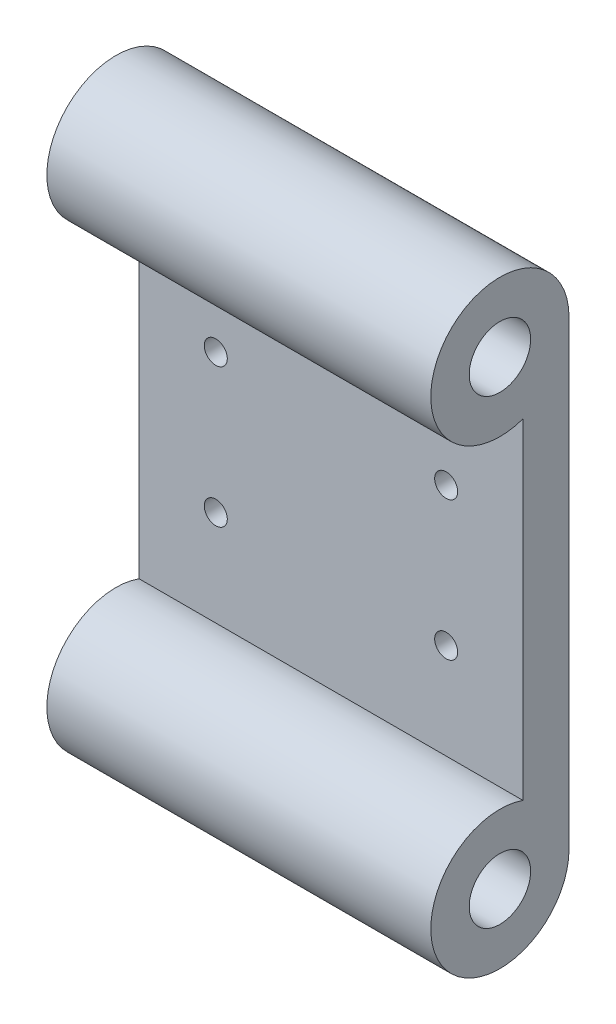
ISO-10303-21;
HEADER;
FILE_DESCRIPTION(('STEP AP214'),'2;1');
FILE_NAME('part.step','',(''),(''),'','','');
FILE_SCHEMA(('AUTOMOTIVE_DESIGN { 1 0 10303 214 1 1 1 1 }'));
ENDSEC;
DATA;
#1=APPLICATION_CONTEXT('core data for automotive mechanical design processes');
#2=APPLICATION_PROTOCOL_DEFINITION('international standard','automotive_design',2000,#1);
#3=PRODUCT_CONTEXT('',#1,'mechanical');
#4=PRODUCT('Part','Part','',(#3));
#5=PRODUCT_RELATED_PRODUCT_CATEGORY('part','',(#4));
#6=PRODUCT_DEFINITION_FORMATION('','',#4);
#7=PRODUCT_DEFINITION_CONTEXT('part definition',#1,'design');
#8=PRODUCT_DEFINITION('design','',#6,#7);
#9=PRODUCT_DEFINITION_SHAPE('','',#8);
#10=(LENGTH_UNIT() NAMED_UNIT(*) SI_UNIT(.MILLI.,.METRE.));
#11=(NAMED_UNIT(*) PLANE_ANGLE_UNIT() SI_UNIT($,.RADIAN.));
#12=(NAMED_UNIT(*) SI_UNIT($,.STERADIAN.) SOLID_ANGLE_UNIT());
#13=UNCERTAINTY_MEASURE_WITH_UNIT(LENGTH_MEASURE(1.E-05),#10,'distance_accuracy_value','');
#14=(GEOMETRIC_REPRESENTATION_CONTEXT(3) GLOBAL_UNCERTAINTY_ASSIGNED_CONTEXT((#13)) GLOBAL_UNIT_ASSIGNED_CONTEXT((#10,
#11,#12)) REPRESENTATION_CONTEXT('',''));
#15=CARTESIAN_POINT('',(0.,0.,0.));
#16=DIRECTION('',(0.,0.,1.));
#17=DIRECTION('',(1.,0.,0.));
#18=AXIS2_PLACEMENT_3D('',#15,#16,#17);
#19=CARTESIAN_POINT('',(50.,30.,0.));
#20=DIRECTION('',(1.,0.,0.));
#21=DIRECTION('',(0.,0.,-1.));
#22=AXIS2_PLACEMENT_3D('',#19,#20,#21);
#23=PLANE('',#22);
#24=CARTESIAN_POINT('',(50.,30.,0.));
#25=DIRECTION('',(1.,0.,0.));
#26=DIRECTION('',(0.,0.,-1.));
#27=AXIS2_PLACEMENT_3D('',#24,#25,#26);
#28=CIRCLE('',#27,4.);
#29=CARTESIAN_POINT('',(50.,30.,-3.99999999999999));
#30=VERTEX_POINT('',#29);
#31=EDGE_CURVE('E103',#30,#30,#28,.T.);
#32=ORIENTED_EDGE('',*,*,#31,.F.);
#33=EDGE_LOOP('',(#32));
#34=FACE_BOUND('',#33,.T.);
#35=CARTESIAN_POINT('',(50.,30.,0.));
#36=DIRECTION('',(1.,0.,0.));
#37=DIRECTION('',(0.,0.,-1.));
#38=AXIS2_PLACEMENT_3D('',#35,#36,#37);
#39=CIRCLE('',#38,9.);
#40=CARTESIAN_POINT('',(50.,30.,-8.99999999999999));
#41=VERTEX_POINT('',#40);
#42=CARTESIAN_POINT('',(50.,21.5147186257614,-2.99999999999999));
#43=VERTEX_POINT('',#42);
#44=EDGE_CURVE('E87',#41,#43,#39,.T.);
#45=ORIENTED_EDGE('',*,*,#44,.T.);
#46=DIRECTION('',(0.,-1.,0.));
#47=VECTOR('',#46,1.);
#48=CARTESIAN_POINT('',(50.,-21.5147186257614,-3.));
#49=LINE('',#48,#47);
#50=CARTESIAN_POINT('',(50.,-21.5147186257614,-3.00000000000001));
#51=VERTEX_POINT('',#50);
#52=EDGE_CURVE('E82',#43,#51,#49,.T.);
#53=ORIENTED_EDGE('',*,*,#52,.T.);
#54=CARTESIAN_POINT('',(50.,-30.,0.));
#55=DIRECTION('',(1.,0.,0.));
#56=DIRECTION('',(0.,0.,-1.));
#57=AXIS2_PLACEMENT_3D('',#54,#55,#56);
#58=CIRCLE('',#57,9.);
#59=CARTESIAN_POINT('',(50.,-30.,-9.00000000000001));
#60=VERTEX_POINT('',#59);
#61=EDGE_CURVE('E85',#51,#60,#58,.T.);
#62=ORIENTED_EDGE('',*,*,#61,.T.);
#63=DIRECTION('',(0.,1.,0.));
#64=VECTOR('',#63,1.);
#65=CARTESIAN_POINT('',(50.,30.,-8.99999999999999));
#66=LINE('',#65,#64);
#67=EDGE_CURVE('E52',#60,#41,#66,.T.);
#68=ORIENTED_EDGE('',*,*,#67,.T.);
#69=EDGE_LOOP('',(#45,#53,#62,#68));
#70=FACE_BOUND('',#69,.T.);
#71=CARTESIAN_POINT('',(50.,-30.,0.));
#72=DIRECTION('',(1.,0.,0.));
#73=DIRECTION('',(0.,0.,-1.));
#74=AXIS2_PLACEMENT_3D('',#71,#72,#73);
#75=CIRCLE('',#74,4.);
#76=CARTESIAN_POINT('',(50.,-30.,-4.00000000000001));
#77=VERTEX_POINT('',#76);
#78=EDGE_CURVE('E132',#77,#77,#75,.T.);
#79=ORIENTED_EDGE('',*,*,#78,.F.);
#80=EDGE_LOOP('',(#79));
#81=FACE_BOUND('',#80,.T.);
#82=ADVANCED_FACE('F33',(#34,#70,#81),#23,.T.);
#83=CARTESIAN_POINT('',(0.,30.,0.));
#84=DIRECTION('',(1.,0.,0.));
#85=DIRECTION('',(0.,0.,-1.));
#86=AXIS2_PLACEMENT_3D('',#83,#84,#85);
#87=PLANE('',#86);
#88=CARTESIAN_POINT('',(0.,30.,0.));
#89=DIRECTION('',(1.,0.,0.));
#90=DIRECTION('',(0.,0.,-1.));
#91=AXIS2_PLACEMENT_3D('',#88,#89,#90);
#92=CIRCLE('',#91,9.);
#93=CARTESIAN_POINT('',(0.,30.,-8.99999999999999));
#94=VERTEX_POINT('',#93);
#95=CARTESIAN_POINT('',(0.,21.5147186257614,-2.99999999999999));
#96=VERTEX_POINT('',#95);
#97=EDGE_CURVE('E100',#94,#96,#92,.T.);
#98=ORIENTED_EDGE('',*,*,#97,.F.);
#99=DIRECTION('',(0.,1.,0.));
#100=VECTOR('',#99,1.);
#101=CARTESIAN_POINT('',(0.,30.,-8.99999999999999));
#102=LINE('',#101,#100);
#103=CARTESIAN_POINT('',(0.,-30.,-9.00000000000001));
#104=VERTEX_POINT('',#103);
#105=EDGE_CURVE('E75',#104,#94,#102,.T.);
#106=ORIENTED_EDGE('',*,*,#105,.F.);
#107=CARTESIAN_POINT('',(0.,-30.,0.));
#108=DIRECTION('',(1.,0.,0.));
#109=DIRECTION('',(0.,0.,-1.));
#110=AXIS2_PLACEMENT_3D('',#107,#108,#109);
#111=CIRCLE('',#110,9.);
#112=CARTESIAN_POINT('',(0.,-21.5147186257614,-3.00000000000001));
#113=VERTEX_POINT('',#112);
#114=EDGE_CURVE('E69',#113,#104,#111,.T.);
#115=ORIENTED_EDGE('',*,*,#114,.F.);
#116=DIRECTION('',(0.,-1.,0.));
#117=VECTOR('',#116,1.);
#118=CARTESIAN_POINT('',(0.,-21.5147186257614,-3.));
#119=LINE('',#118,#117);
#120=EDGE_CURVE('E91',#96,#113,#119,.T.);
#121=ORIENTED_EDGE('',*,*,#120,.F.);
#122=EDGE_LOOP('',(#98,#106,#115,#121));
#123=FACE_BOUND('',#122,.T.);
#124=CARTESIAN_POINT('',(0.,30.,0.));
#125=DIRECTION('',(1.,0.,0.));
#126=DIRECTION('',(0.,0.,-1.));
#127=AXIS2_PLACEMENT_3D('',#124,#125,#126);
#128=CIRCLE('',#127,4.);
#129=CARTESIAN_POINT('',(0.,30.,-3.99999999999999));
#130=VERTEX_POINT('',#129);
#131=EDGE_CURVE('E135',#130,#130,#128,.T.);
#132=ORIENTED_EDGE('',*,*,#131,.T.);
#133=EDGE_LOOP('',(#132));
#134=FACE_BOUND('',#133,.T.);
#135=CARTESIAN_POINT('',(0.,-30.,0.));
#136=DIRECTION('',(1.,0.,0.));
#137=DIRECTION('',(0.,0.,-1.));
#138=AXIS2_PLACEMENT_3D('',#135,#136,#137);
#139=CIRCLE('',#138,4.);
#140=CARTESIAN_POINT('',(0.,-30.,-4.00000000000001));
#141=VERTEX_POINT('',#140);
#142=EDGE_CURVE('E112',#141,#141,#139,.T.);
#143=ORIENTED_EDGE('',*,*,#142,.T.);
#144=EDGE_LOOP('',(#143));
#145=FACE_BOUND('',#144,.T.);
#146=ADVANCED_FACE('F143',(#123,#134,#145),#87,.F.);
#147=CARTESIAN_POINT('',(50.,30.,0.));
#148=DIRECTION('',(-1.,0.,0.));
#149=DIRECTION('',(0.,0.,1.));
#150=AXIS2_PLACEMENT_3D('',#147,#148,#149);
#151=CYLINDRICAL_SURFACE('',#150,9.);
#152=ORIENTED_EDGE('',*,*,#97,.T.);
#153=DIRECTION('',(-1.,0.,0.));
#154=VECTOR('',#153,1.);
#155=CARTESIAN_POINT('',(50.,21.5147186257614,-2.99999999999999));
#156=LINE('',#155,#154);
#157=EDGE_CURVE('E11',#43,#96,#156,.T.);
#158=ORIENTED_EDGE('',*,*,#157,.F.);
#159=ORIENTED_EDGE('',*,*,#44,.F.);
#160=DIRECTION('',(-1.,0.,0.));
#161=VECTOR('',#160,1.);
#162=CARTESIAN_POINT('',(50.,30.,-8.99999999999999));
#163=LINE('',#162,#161);
#164=EDGE_CURVE('E96',#41,#94,#163,.T.);
#165=ORIENTED_EDGE('',*,*,#164,.T.);
#166=EDGE_LOOP('',(#152,#158,#159,#165));
#167=FACE_BOUND('',#166,.T.);
#168=ADVANCED_FACE('F35',(#167),#151,.T.);
#169=CARTESIAN_POINT('',(50.,-21.5147186257614,-3.));
#170=DIRECTION('',(0.,0.,-1.));
#171=DIRECTION('',(0.,1.,0.));
#172=AXIS2_PLACEMENT_3D('',#169,#170,#171);
#173=PLANE('',#172);
#174=CARTESIAN_POINT('',(40.,9.04442852285327,-3.));
#175=DIRECTION('',(0.,0.,1.));
#176=DIRECTION('',(1.,0.,0.));
#177=AXIS2_PLACEMENT_3D('',#174,#175,#176);
#178=CIRCLE('',#177,1.5);
#179=CARTESIAN_POINT('',(41.5,9.04442852285327,-3.));
#180=VERTEX_POINT('',#179);
#181=EDGE_CURVE('E117',#180,#180,#178,.T.);
#182=ORIENTED_EDGE('',*,*,#181,.F.);
#183=EDGE_LOOP('',(#182));
#184=FACE_BOUND('',#183,.T.);
#185=CARTESIAN_POINT('',(40.,-9.04442852285327,-3.));
#186=DIRECTION('',(0.,0.,1.));
#187=DIRECTION('',(1.,0.,0.));
#188=AXIS2_PLACEMENT_3D('',#185,#186,#187);
#189=CIRCLE('',#188,1.5);
#190=CARTESIAN_POINT('',(41.5,-9.04442852285327,-3.));
#191=VERTEX_POINT('',#190);
#192=EDGE_CURVE('E183',#191,#191,#189,.T.);
#193=ORIENTED_EDGE('',*,*,#192,.F.);
#194=EDGE_LOOP('',(#193));
#195=FACE_BOUND('',#194,.T.);
#196=CARTESIAN_POINT('',(10.,-9.04442852285327,-3.));
#197=DIRECTION('',(0.,0.,1.));
#198=DIRECTION('',(1.,0.,0.));
#199=AXIS2_PLACEMENT_3D('',#196,#197,#198);
#200=CIRCLE('',#199,1.5);
#201=CARTESIAN_POINT('',(11.5,-9.04442852285327,-3.));
#202=VERTEX_POINT('',#201);
#203=EDGE_CURVE('E130',#202,#202,#200,.T.);
#204=ORIENTED_EDGE('',*,*,#203,.F.);
#205=EDGE_LOOP('',(#204));
#206=FACE_BOUND('',#205,.T.);
#207=CARTESIAN_POINT('',(10.,9.04442852285326,-3.));
#208=DIRECTION('',(0.,0.,1.));
#209=DIRECTION('',(1.,0.,0.));
#210=AXIS2_PLACEMENT_3D('',#207,#208,#209);
#211=CIRCLE('',#210,1.5);
#212=CARTESIAN_POINT('',(11.5,9.04442852285326,-3.));
#213=VERTEX_POINT('',#212);
#214=EDGE_CURVE('E113',#213,#213,#211,.T.);
#215=ORIENTED_EDGE('',*,*,#214,.F.);
#216=EDGE_LOOP('',(#215));
#217=FACE_BOUND('',#216,.T.);
#218=ORIENTED_EDGE('',*,*,#120,.T.);
#219=DIRECTION('',(-1.,0.,0.));
#220=VECTOR('',#219,1.);
#221=CARTESIAN_POINT('',(50.,-21.5147186257614,-3.00000000000001));
#222=LINE('',#221,#220);
#223=EDGE_CURVE('E43',#51,#113,#222,.T.);
#224=ORIENTED_EDGE('',*,*,#223,.F.);
#225=ORIENTED_EDGE('',*,*,#52,.F.);
#226=ORIENTED_EDGE('',*,*,#157,.T.);
#227=EDGE_LOOP('',(#218,#224,#225,#226));
#228=FACE_BOUND('',#227,.T.);
#229=ADVANCED_FACE('F90',(#184,#195,#206,#217,#228),#173,.F.);
#230=CARTESIAN_POINT('',(50.,-30.,0.));
#231=DIRECTION('',(-1.,0.,0.));
#232=DIRECTION('',(0.,0.,1.));
#233=AXIS2_PLACEMENT_3D('',#230,#231,#232);
#234=CYLINDRICAL_SURFACE('',#233,9.);
#235=ORIENTED_EDGE('',*,*,#114,.T.);
#236=DIRECTION('',(-1.,0.,0.));
#237=VECTOR('',#236,1.);
#238=CARTESIAN_POINT('',(50.,-30.,-9.00000000000001));
#239=LINE('',#238,#237);
#240=EDGE_CURVE('E92',#60,#104,#239,.T.);
#241=ORIENTED_EDGE('',*,*,#240,.F.);
#242=ORIENTED_EDGE('',*,*,#61,.F.);
#243=ORIENTED_EDGE('',*,*,#223,.T.);
#244=EDGE_LOOP('',(#235,#241,#242,#243));
#245=FACE_BOUND('',#244,.T.);
#246=ADVANCED_FACE('F94',(#245),#234,.T.);
#247=CARTESIAN_POINT('',(50.,30.,-8.99999999999999));
#248=DIRECTION('',(0.,0.,1.));
#249=DIRECTION('',(0.,-1.,0.));
#250=AXIS2_PLACEMENT_3D('',#247,#248,#249);
#251=PLANE('',#250);
#252=CARTESIAN_POINT('',(40.,9.04442852285327,-9.));
#253=DIRECTION('',(0.,0.,1.));
#254=DIRECTION('',(0.,-1.,0.));
#255=AXIS2_PLACEMENT_3D('',#252,#253,#254);
#256=CIRCLE('',#255,1.5);
#257=CARTESIAN_POINT('',(40.,7.54442852285326,-9.));
#258=VERTEX_POINT('',#257);
#259=EDGE_CURVE('E37',#258,#258,#256,.T.);
#260=ORIENTED_EDGE('',*,*,#259,.T.);
#261=EDGE_LOOP('',(#260));
#262=FACE_BOUND('',#261,.T.);
#263=CARTESIAN_POINT('',(40.,-9.04442852285327,-9.00000000000001));
#264=DIRECTION('',(0.,0.,1.));
#265=DIRECTION('',(0.,-1.,0.));
#266=AXIS2_PLACEMENT_3D('',#263,#264,#265);
#267=CIRCLE('',#266,1.5);
#268=CARTESIAN_POINT('',(40.,-10.5444285228533,-9.00000000000001));
#269=VERTEX_POINT('',#268);
#270=EDGE_CURVE('E116',#269,#269,#267,.T.);
#271=ORIENTED_EDGE('',*,*,#270,.T.);
#272=EDGE_LOOP('',(#271));
#273=FACE_BOUND('',#272,.T.);
#274=CARTESIAN_POINT('',(10.,-9.04442852285327,-9.00000000000001));
#275=DIRECTION('',(0.,0.,1.));
#276=DIRECTION('',(0.,-1.,0.));
#277=AXIS2_PLACEMENT_3D('',#274,#275,#276);
#278=CIRCLE('',#277,1.5);
#279=CARTESIAN_POINT('',(10.,-10.5444285228533,-9.00000000000001));
#280=VERTEX_POINT('',#279);
#281=EDGE_CURVE('E114',#280,#280,#278,.T.);
#282=ORIENTED_EDGE('',*,*,#281,.T.);
#283=EDGE_LOOP('',(#282));
#284=FACE_BOUND('',#283,.T.);
#285=CARTESIAN_POINT('',(10.,9.04442852285326,-9.));
#286=DIRECTION('',(0.,0.,1.));
#287=DIRECTION('',(0.,-1.,0.));
#288=AXIS2_PLACEMENT_3D('',#285,#286,#287);
#289=CIRCLE('',#288,1.5);
#290=CARTESIAN_POINT('',(10.,7.54442852285326,-9.));
#291=VERTEX_POINT('',#290);
#292=EDGE_CURVE('E109',#291,#291,#289,.T.);
#293=ORIENTED_EDGE('',*,*,#292,.T.);
#294=EDGE_LOOP('',(#293));
#295=FACE_BOUND('',#294,.T.);
#296=ORIENTED_EDGE('',*,*,#105,.T.);
#297=ORIENTED_EDGE('',*,*,#164,.F.);
#298=ORIENTED_EDGE('',*,*,#67,.F.);
#299=ORIENTED_EDGE('',*,*,#240,.T.);
#300=EDGE_LOOP('',(#296,#297,#298,#299));
#301=FACE_BOUND('',#300,.T.);
#302=ADVANCED_FACE('F149',(#262,#273,#284,#295,#301),#251,.F.);
#303=CARTESIAN_POINT('',(50.,30.,0.));
#304=DIRECTION('',(-1.,0.,0.));
#305=DIRECTION('',(0.,0.,1.));
#306=AXIS2_PLACEMENT_3D('',#303,#304,#305);
#307=CYLINDRICAL_SURFACE('',#306,4.);
#308=ORIENTED_EDGE('',*,*,#31,.T.);
#309=EDGE_LOOP('',(#308));
#310=FACE_BOUND('',#309,.T.);
#311=ORIENTED_EDGE('',*,*,#131,.F.);
#312=EDGE_LOOP('',(#311));
#313=FACE_BOUND('',#312,.T.);
#314=ADVANCED_FACE('F146',(#310,#313),#307,.F.);
#315=CARTESIAN_POINT('',(50.,-30.,0.));
#316=DIRECTION('',(-1.,0.,0.));
#317=DIRECTION('',(0.,0.,1.));
#318=AXIS2_PLACEMENT_3D('',#315,#316,#317);
#319=CYLINDRICAL_SURFACE('',#318,4.);
#320=ORIENTED_EDGE('',*,*,#78,.T.);
#321=EDGE_LOOP('',(#320));
#322=FACE_BOUND('',#321,.T.);
#323=ORIENTED_EDGE('',*,*,#142,.F.);
#324=EDGE_LOOP('',(#323));
#325=FACE_BOUND('',#324,.T.);
#326=ADVANCED_FACE('F148',(#322,#325),#319,.F.);
#327=CARTESIAN_POINT('',(10.,9.04442852285326,-43.));
#328=DIRECTION('',(0.,0.,1.));
#329=DIRECTION('',(1.,0.,0.));
#330=AXIS2_PLACEMENT_3D('',#327,#328,#329);
#331=CYLINDRICAL_SURFACE('',#330,1.5);
#332=ORIENTED_EDGE('',*,*,#214,.T.);
#333=EDGE_LOOP('',(#332));
#334=FACE_BOUND('',#333,.T.);
#335=ORIENTED_EDGE('',*,*,#292,.F.);
#336=EDGE_LOOP('',(#335));
#337=FACE_BOUND('',#336,.T.);
#338=ADVANCED_FACE('F156',(#334,#337),#331,.F.);
#339=CARTESIAN_POINT('',(10.,-9.04442852285327,-43.));
#340=DIRECTION('',(0.,0.,1.));
#341=DIRECTION('',(1.,0.,0.));
#342=AXIS2_PLACEMENT_3D('',#339,#340,#341);
#343=CYLINDRICAL_SURFACE('',#342,1.5);
#344=ORIENTED_EDGE('',*,*,#203,.T.);
#345=EDGE_LOOP('',(#344));
#346=FACE_BOUND('',#345,.T.);
#347=ORIENTED_EDGE('',*,*,#281,.F.);
#348=EDGE_LOOP('',(#347));
#349=FACE_BOUND('',#348,.T.);
#350=ADVANCED_FACE('F199',(#346,#349),#343,.F.);
#351=CARTESIAN_POINT('',(40.,-9.04442852285327,-43.));
#352=DIRECTION('',(0.,0.,1.));
#353=DIRECTION('',(1.,0.,0.));
#354=AXIS2_PLACEMENT_3D('',#351,#352,#353);
#355=CYLINDRICAL_SURFACE('',#354,1.5);
#356=ORIENTED_EDGE('',*,*,#192,.T.);
#357=EDGE_LOOP('',(#356));
#358=FACE_BOUND('',#357,.T.);
#359=ORIENTED_EDGE('',*,*,#270,.F.);
#360=EDGE_LOOP('',(#359));
#361=FACE_BOUND('',#360,.T.);
#362=ADVANCED_FACE('F194',(#358,#361),#355,.F.);
#363=CARTESIAN_POINT('',(40.,9.04442852285327,-43.));
#364=DIRECTION('',(0.,0.,1.));
#365=DIRECTION('',(1.,0.,0.));
#366=AXIS2_PLACEMENT_3D('',#363,#364,#365);
#367=CYLINDRICAL_SURFACE('',#366,1.5);
#368=ORIENTED_EDGE('',*,*,#181,.T.);
#369=EDGE_LOOP('',(#368));
#370=FACE_BOUND('',#369,.T.);
#371=ORIENTED_EDGE('',*,*,#259,.F.);
#372=EDGE_LOOP('',(#371));
#373=FACE_BOUND('',#372,.T.);
#374=ADVANCED_FACE('F191',(#370,#373),#367,.F.);
#375=CLOSED_SHELL('',(#82,#146,#168,#229,#246,#302,#314,#326,#338,#350,#362,#374));
#376=MANIFOLD_SOLID_BREP('B2',#375);
#377=ADVANCED_BREP_SHAPE_REPRESENTATION('',(#18,#376),#14);
#378=SHAPE_DEFINITION_REPRESENTATION(#9,#377);
ENDSEC;
END-ISO-10303-21;
